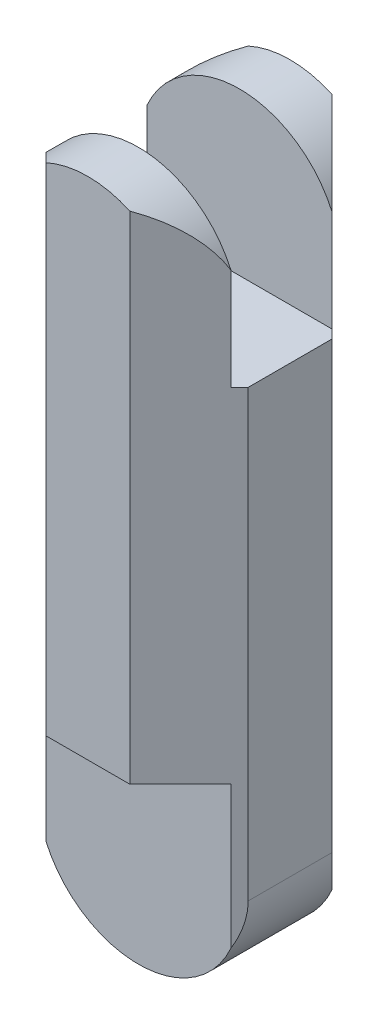
ISO-10303-21;
HEADER;
FILE_DESCRIPTION(('STEP AP214'),'2;1');
FILE_NAME('part.step','',(''),(''),'','','');
FILE_SCHEMA(('AUTOMOTIVE_DESIGN { 1 0 10303 214 1 1 1 1 }'));
ENDSEC;
DATA;
#1=APPLICATION_CONTEXT('core data for automotive mechanical design processes');
#2=APPLICATION_PROTOCOL_DEFINITION('international standard','automotive_design',2000,#1);
#3=PRODUCT_CONTEXT('',#1,'mechanical');
#4=PRODUCT('Part','Part','',(#3));
#5=PRODUCT_RELATED_PRODUCT_CATEGORY('part','',(#4));
#6=PRODUCT_DEFINITION_FORMATION('','',#4);
#7=PRODUCT_DEFINITION_CONTEXT('part definition',#1,'design');
#8=PRODUCT_DEFINITION('design','',#6,#7);
#9=PRODUCT_DEFINITION_SHAPE('','',#8);
#10=(LENGTH_UNIT() NAMED_UNIT(*) SI_UNIT(.MILLI.,.METRE.));
#11=(NAMED_UNIT(*) PLANE_ANGLE_UNIT() SI_UNIT($,.RADIAN.));
#12=(NAMED_UNIT(*) SI_UNIT($,.STERADIAN.) SOLID_ANGLE_UNIT());
#13=UNCERTAINTY_MEASURE_WITH_UNIT(LENGTH_MEASURE(1.E-05),#10,'distance_accuracy_value','');
#14=(GEOMETRIC_REPRESENTATION_CONTEXT(3) GLOBAL_UNCERTAINTY_ASSIGNED_CONTEXT((#13)) GLOBAL_UNIT_ASSIGNED_CONTEXT((#10,
#11,#12)) REPRESENTATION_CONTEXT('',''));
#15=CARTESIAN_POINT('',(0.,0.,0.));
#16=DIRECTION('',(0.,0.,1.));
#17=DIRECTION('',(1.,0.,0.));
#18=AXIS2_PLACEMENT_3D('',#15,#16,#17);
#19=CARTESIAN_POINT('',(4.14213562373094,74.,-10.));
#20=DIRECTION('',(0.,0.,1.));
#21=DIRECTION('',(1.,0.,0.));
#22=AXIS2_PLACEMENT_3D('',#19,#20,#21);
#23=PLANE('',#22);
#24=DIRECTION('',(0.,-1.,0.));
#25=VECTOR('',#24,1.);
#26=CARTESIAN_POINT('',(-4.14213562373096,74.,-10.));
#27=LINE('',#26,#25);
#28=CARTESIAN_POINT('',(-4.14213562373096,69.1017972112445,-10.));
#29=VERTEX_POINT('',#28);
#30=CARTESIAN_POINT('',(-4.14213562373096,20.,-10.));
#31=VERTEX_POINT('',#30);
#32=EDGE_CURVE('E174',#29,#31,#27,.T.);
#33=ORIENTED_EDGE('',*,*,#32,.F.);
#34=CARTESIAN_POINT('',(0.,60.,-10.));
#35=DIRECTION('',(0.,0.,1.));
#36=DIRECTION('',(1.,0.,0.));
#37=AXIS2_PLACEMENT_3D('',#34,#35,#36);
#38=CIRCLE('',#37,10.);
#39=CARTESIAN_POINT('',(4.14213562373094,69.1017972112445,-10.));
#40=VERTEX_POINT('',#39);
#41=EDGE_CURVE('E297',#29,#40,#38,.F.);
#42=ORIENTED_EDGE('',*,*,#41,.T.);
#43=DIRECTION('',(0.,-1.,0.));
#44=VECTOR('',#43,1.);
#45=CARTESIAN_POINT('',(4.14213562373094,74.,-10.));
#46=LINE('',#45,#44);
#47=CARTESIAN_POINT('',(4.14213562373094,20.,-10.));
#48=VERTEX_POINT('',#47);
#49=EDGE_CURVE('E176',#40,#48,#46,.T.);
#50=ORIENTED_EDGE('',*,*,#49,.T.);
#51=DIRECTION('',(1.,0.,0.));
#52=VECTOR('',#51,1.);
#53=CARTESIAN_POINT('',(10.,20.,-10.));
#54=LINE('',#53,#52);
#55=EDGE_CURVE('E232',#31,#48,#54,.T.);
#56=ORIENTED_EDGE('',*,*,#55,.F.);
#57=EDGE_LOOP('',(#33,#42,#50,#56));
#58=FACE_BOUND('',#57,.T.);
#59=ADVANCED_FACE('F34',(#58),#23,.F.);
#60=CARTESIAN_POINT('',(-4.14213562373096,74.,10.));
#61=DIRECTION('',(0.,0.,-1.));
#62=DIRECTION('',(-1.,0.,0.));
#63=AXIS2_PLACEMENT_3D('',#60,#61,#62);
#64=PLANE('',#63);
#65=DIRECTION('',(0.,-1.,0.));
#66=VECTOR('',#65,1.);
#67=CARTESIAN_POINT('',(4.14213562373096,74.,10.));
#68=LINE('',#67,#66);
#69=CARTESIAN_POINT('',(4.14213562373096,69.1017972112445,10.));
#70=VERTEX_POINT('',#69);
#71=CARTESIAN_POINT('',(4.14213562373096,20.,10.));
#72=VERTEX_POINT('',#71);
#73=EDGE_CURVE('E159',#70,#72,#68,.T.);
#74=ORIENTED_EDGE('',*,*,#73,.F.);
#75=CARTESIAN_POINT('',(0.,60.,10.));
#76=DIRECTION('',(0.,0.,-1.));
#77=DIRECTION('',(1.,0.,0.));
#78=AXIS2_PLACEMENT_3D('',#75,#76,#77);
#79=CIRCLE('',#78,10.);
#80=CARTESIAN_POINT('',(-4.14213562373096,69.1017972112445,10.));
#81=VERTEX_POINT('',#80);
#82=EDGE_CURVE('E147',#81,#70,#79,.T.);
#83=ORIENTED_EDGE('',*,*,#82,.F.);
#84=DIRECTION('',(0.,-1.,0.));
#85=VECTOR('',#84,1.);
#86=CARTESIAN_POINT('',(-4.14213562373096,74.,10.));
#87=LINE('',#86,#85);
#88=CARTESIAN_POINT('',(-4.14213562373096,20.,10.));
#89=VERTEX_POINT('',#88);
#90=EDGE_CURVE('E157',#81,#89,#87,.T.);
#91=ORIENTED_EDGE('',*,*,#90,.T.);
#92=DIRECTION('',(-1.,0.,0.));
#93=VECTOR('',#92,1.);
#94=CARTESIAN_POINT('',(-10.,20.,10.));
#95=LINE('',#94,#93);
#96=EDGE_CURVE('E245',#72,#89,#95,.T.);
#97=ORIENTED_EDGE('',*,*,#96,.F.);
#98=EDGE_LOOP('',(#74,#83,#91,#97));
#99=FACE_BOUND('',#98,.T.);
#100=ADVANCED_FACE('F155',(#99),#64,.F.);
#101=CARTESIAN_POINT('',(10.,74.,-4.14213562373095));
#102=DIRECTION('',(-0.707106781186547,0.,0.707106781186548));
#103=DIRECTION('',(0.707106781186548,0.,0.707106781186547));
#104=AXIS2_PLACEMENT_3D('',#101,#102,#103);
#105=PLANE('',#104);
#106=ORIENTED_EDGE('',*,*,#49,.F.);
#107=CARTESIAN_POINT('',(0.,60.,-14.1421356237309));
#108=DIRECTION('',(-0.707106781186547,0.,0.707106781186548));
#109=DIRECTION('',(0.707106781186548,0.,0.707106781186547));
#110=AXIS2_PLACEMENT_3D('',#107,#108,#109);
#111=ELLIPSE('',#110,14.1421356237309,10.);
#112=CARTESIAN_POINT('',(9.14213562373095,64.0523272618718,-5.));
#113=VERTEX_POINT('',#112);
#114=EDGE_CURVE('E300',#40,#113,#111,.F.);
#115=ORIENTED_EDGE('',*,*,#114,.T.);
#116=DIRECTION('',(0.,1.,0.));
#117=VECTOR('',#116,1.);
#118=CARTESIAN_POINT('',(9.14213562373095,74.,-5.));
#119=LINE('',#118,#117);
#120=CARTESIAN_POINT('',(9.14213562373095,54.,-5.));
#121=VERTEX_POINT('',#120);
#122=EDGE_CURVE('E221',#121,#113,#119,.T.);
#123=ORIENTED_EDGE('',*,*,#122,.F.);
#124=DIRECTION('',(0.707106781186548,0.,0.707106781186547));
#125=VECTOR('',#124,1.);
#126=CARTESIAN_POINT('',(10.,54.,-4.14213562373095));
#127=LINE('',#126,#125);
#128=CARTESIAN_POINT('',(10.,54.,-4.14213562373095));
#129=VERTEX_POINT('',#128);
#130=EDGE_CURVE('E230',#121,#129,#127,.T.);
#131=ORIENTED_EDGE('',*,*,#130,.T.);
#132=DIRECTION('',(0.,-1.,0.));
#133=VECTOR('',#132,1.);
#134=CARTESIAN_POINT('',(10.,74.,-4.14213562373095));
#135=LINE('',#134,#133);
#136=CARTESIAN_POINT('',(10.,10.,-4.14213562373095));
#137=VERTEX_POINT('',#136);
#138=EDGE_CURVE('E178',#129,#137,#135,.T.);
#139=ORIENTED_EDGE('',*,*,#138,.T.);
#140=CARTESIAN_POINT('',(0.,10.,-14.1421356237309));
#141=DIRECTION('',(-0.707106781186547,0.,0.707106781186548));
#142=DIRECTION('',(0.707106781186548,0.,0.707106781186547));
#143=AXIS2_PLACEMENT_3D('',#140,#141,#142);
#144=ELLIPSE('',#143,14.1421356237309,10.);
#145=CARTESIAN_POINT('',(9.14213562373095,5.94767273812816,-5.00000000000001));
#146=VERTEX_POINT('',#145);
#147=EDGE_CURVE('E269',#137,#146,#144,.F.);
#148=ORIENTED_EDGE('',*,*,#147,.T.);
#149=DIRECTION('',(0.,-1.,0.));
#150=VECTOR('',#149,1.);
#151=CARTESIAN_POINT('',(9.14213562373095,74.,-5.00000000000001));
#152=LINE('',#151,#150);
#153=CARTESIAN_POINT('',(9.14213562373095,20.,-5.00000000000001));
#154=VERTEX_POINT('',#153);
#155=EDGE_CURVE('E238',#154,#146,#152,.T.);
#156=ORIENTED_EDGE('',*,*,#155,.F.);
#157=DIRECTION('',(-0.707106781186548,0.,-0.707106781186547));
#158=VECTOR('',#157,1.);
#159=CARTESIAN_POINT('',(10.,20.,-4.14213562373095));
#160=LINE('',#159,#158);
#161=EDGE_CURVE('E242',#154,#48,#160,.T.);
#162=ORIENTED_EDGE('',*,*,#161,.T.);
#163=EDGE_LOOP('',(#106,#115,#123,#131,#139,#148,#156,#162));
#164=FACE_BOUND('',#163,.T.);
#165=ADVANCED_FACE('F275',(#164),#105,.F.);
#166=CARTESIAN_POINT('',(-4.14213562373096,74.,-10.));
#167=DIRECTION('',(0.707106781186548,0.,0.707106781186547));
#168=DIRECTION('',(0.707106781186547,0.,-0.707106781186548));
#169=AXIS2_PLACEMENT_3D('',#166,#167,#168);
#170=PLANE('',#169);
#171=DIRECTION('',(0.,-1.,0.));
#172=VECTOR('',#171,1.);
#173=CARTESIAN_POINT('',(-9.14213562373095,74.,-5.));
#174=LINE('',#173,#172);
#175=CARTESIAN_POINT('',(-9.14213562373095,64.0523272618718,-5.));
#176=VERTEX_POINT('',#175);
#177=CARTESIAN_POINT('',(-9.14213562373095,54.,-5.));
#178=VERTEX_POINT('',#177);
#179=EDGE_CURVE('E219',#176,#178,#174,.T.);
#180=ORIENTED_EDGE('',*,*,#179,.F.);
#181=CARTESIAN_POINT('',(0.,60.,-14.142135623731));
#182=DIRECTION('',(0.707106781186548,0.,0.707106781186547));
#183=DIRECTION('',(-0.707106781186547,0.,0.707106781186548));
#184=AXIS2_PLACEMENT_3D('',#181,#182,#183);
#185=ELLIPSE('',#184,14.142135623731,10.);
#186=EDGE_CURVE('E49',#176,#29,#185,.F.);
#187=ORIENTED_EDGE('',*,*,#186,.T.);
#188=ORIENTED_EDGE('',*,*,#32,.T.);
#189=DIRECTION('',(-0.707106781186547,0.,0.707106781186548));
#190=VECTOR('',#189,1.);
#191=CARTESIAN_POINT('',(-4.14213562373096,20.,-10.));
#192=LINE('',#191,#190);
#193=CARTESIAN_POINT('',(-9.14213562373096,20.,-5.));
#194=VERTEX_POINT('',#193);
#195=EDGE_CURVE('E187',#31,#194,#192,.T.);
#196=ORIENTED_EDGE('',*,*,#195,.T.);
#197=DIRECTION('',(0.,1.,0.));
#198=VECTOR('',#197,1.);
#199=CARTESIAN_POINT('',(-9.14213562373095,74.,-5.));
#200=LINE('',#199,#198);
#201=CARTESIAN_POINT('',(-9.14213562373095,5.94767273812823,-5.));
#202=VERTEX_POINT('',#201);
#203=EDGE_CURVE('E185',#202,#194,#200,.T.);
#204=ORIENTED_EDGE('',*,*,#203,.F.);
#205=CARTESIAN_POINT('',(0.,10.,-14.142135623731));
#206=DIRECTION('',(0.707106781186548,0.,0.707106781186547));
#207=DIRECTION('',(-0.707106781186547,0.,0.707106781186548));
#208=AXIS2_PLACEMENT_3D('',#205,#206,#207);
#209=ELLIPSE('',#208,14.142135623731,10.);
#210=CARTESIAN_POINT('',(-10.,10.,-4.14213562373095));
#211=VERTEX_POINT('',#210);
#212=EDGE_CURVE('E259',#202,#211,#209,.F.);
#213=ORIENTED_EDGE('',*,*,#212,.T.);
#214=DIRECTION('',(0.,-1.,0.));
#215=VECTOR('',#214,1.);
#216=CARTESIAN_POINT('',(-10.,74.,-4.14213562373095));
#217=LINE('',#216,#215);
#218=CARTESIAN_POINT('',(-10.,54.,-4.14213562373095));
#219=VERTEX_POINT('',#218);
#220=EDGE_CURVE('E167',#219,#211,#217,.T.);
#221=ORIENTED_EDGE('',*,*,#220,.F.);
#222=DIRECTION('',(0.707106781186547,0.,-0.707106781186548));
#223=VECTOR('',#222,1.);
#224=CARTESIAN_POINT('',(-4.14213562373096,54.,-10.));
#225=LINE('',#224,#223);
#226=EDGE_CURVE('E227',#219,#178,#225,.T.);
#227=ORIENTED_EDGE('',*,*,#226,.T.);
#228=EDGE_LOOP('',(#180,#187,#188,#196,#204,#213,#221,#227));
#229=FACE_BOUND('',#228,.T.);
#230=ADVANCED_FACE('F288',(#229),#170,.F.);
#231=CARTESIAN_POINT('',(0.,0.,-5.));
#232=DIRECTION('',(0.,0.,1.));
#233=DIRECTION('',(1.,0.,0.));
#234=AXIS2_PLACEMENT_3D('',#231,#232,#233);
#235=PLANE('',#234);
#236=CARTESIAN_POINT('',(0.,60.,-5.));
#237=DIRECTION('',(0.,0.,1.));
#238=DIRECTION('',(1.,0.,0.));
#239=AXIS2_PLACEMENT_3D('',#236,#237,#238);
#240=CIRCLE('',#239,10.);
#241=EDGE_CURVE('E151',#176,#113,#240,.F.);
#242=ORIENTED_EDGE('',*,*,#241,.F.);
#243=ORIENTED_EDGE('',*,*,#179,.T.);
#244=DIRECTION('',(1.,0.,0.));
#245=VECTOR('',#244,1.);
#246=CARTESIAN_POINT('',(-10.,54.,-5.));
#247=LINE('',#246,#245);
#248=EDGE_CURVE('E213',#178,#121,#247,.T.);
#249=ORIENTED_EDGE('',*,*,#248,.T.);
#250=ORIENTED_EDGE('',*,*,#122,.T.);
#251=EDGE_LOOP('',(#242,#243,#249,#250));
#252=FACE_BOUND('',#251,.T.);
#253=ADVANCED_FACE('F304',(#252),#235,.T.);
#254=CARTESIAN_POINT('',(0.,0.,5.));
#255=DIRECTION('',(0.,0.,1.));
#256=DIRECTION('',(1.,0.,0.));
#257=AXIS2_PLACEMENT_3D('',#254,#255,#256);
#258=PLANE('',#257);
#259=DIRECTION('',(0.,-1.,0.));
#260=VECTOR('',#259,1.);
#261=CARTESIAN_POINT('',(-9.14213562373096,74.,5.));
#262=LINE('',#261,#260);
#263=CARTESIAN_POINT('',(-9.14213562373096,64.0523272618718,5.));
#264=VERTEX_POINT('',#263);
#265=CARTESIAN_POINT('',(-9.14213562373096,54.,5.));
#266=VERTEX_POINT('',#265);
#267=EDGE_CURVE('E211',#264,#266,#262,.T.);
#268=ORIENTED_EDGE('',*,*,#267,.F.);
#269=CARTESIAN_POINT('',(0.,60.,5.));
#270=DIRECTION('',(0.,0.,1.));
#271=DIRECTION('',(1.,0.,0.));
#272=AXIS2_PLACEMENT_3D('',#269,#270,#271);
#273=CIRCLE('',#272,10.);
#274=CARTESIAN_POINT('',(9.14213562373096,64.0523272618718,5.));
#275=VERTEX_POINT('',#274);
#276=EDGE_CURVE('E11',#264,#275,#273,.F.);
#277=ORIENTED_EDGE('',*,*,#276,.T.);
#278=DIRECTION('',(0.,1.,0.));
#279=VECTOR('',#278,1.);
#280=CARTESIAN_POINT('',(9.14213562373096,74.,5.));
#281=LINE('',#280,#279);
#282=CARTESIAN_POINT('',(9.14213562373096,54.,5.));
#283=VERTEX_POINT('',#282);
#284=EDGE_CURVE('E194',#283,#275,#281,.T.);
#285=ORIENTED_EDGE('',*,*,#284,.F.);
#286=DIRECTION('',(1.,0.,0.));
#287=VECTOR('',#286,1.);
#288=CARTESIAN_POINT('',(-10.,54.,5.));
#289=LINE('',#288,#287);
#290=EDGE_CURVE('E205',#266,#283,#289,.T.);
#291=ORIENTED_EDGE('',*,*,#290,.F.);
#292=EDGE_LOOP('',(#268,#277,#285,#291));
#293=FACE_BOUND('',#292,.T.);
#294=ADVANCED_FACE('F323',(#293),#258,.F.);
#295=CARTESIAN_POINT('',(0.,10.,-56.));
#296=DIRECTION('',(0.,0.,1.));
#297=DIRECTION('',(1.,0.,0.));
#298=AXIS2_PLACEMENT_3D('',#295,#296,#297);
#299=CYLINDRICAL_SURFACE('',#298,10.);
#300=CARTESIAN_POINT('',(0.,10.,-5.));
#301=DIRECTION('',(0.,0.,-1.));
#302=DIRECTION('',(-1.,0.,0.));
#303=AXIS2_PLACEMENT_3D('',#300,#301,#302);
#304=CIRCLE('',#303,10.);
#305=EDGE_CURVE('E233',#146,#202,#304,.T.);
#306=ORIENTED_EDGE('',*,*,#305,.F.);
#307=ORIENTED_EDGE('',*,*,#147,.F.);
#308=DIRECTION('',(0.,0.,1.));
#309=VECTOR('',#308,1.);
#310=CARTESIAN_POINT('',(10.,10.,-56.));
#311=LINE('',#310,#309);
#312=CARTESIAN_POINT('',(10.,9.99999999999999,4.14213562373095));
#313=VERTEX_POINT('',#312);
#314=EDGE_CURVE('E256',#137,#313,#311,.T.);
#315=ORIENTED_EDGE('',*,*,#314,.T.);
#316=CARTESIAN_POINT('',(0.,10.,14.1421356237309));
#317=DIRECTION('',(-0.707106781186547,0.,-0.707106781186548));
#318=DIRECTION('',(-0.707106781186548,0.,0.707106781186547));
#319=AXIS2_PLACEMENT_3D('',#316,#317,#318);
#320=ELLIPSE('',#319,14.1421356237309,10.);
#321=CARTESIAN_POINT('',(9.14213562373095,5.94767273812818,5.));
#322=VERTEX_POINT('',#321);
#323=EDGE_CURVE('E264',#322,#313,#320,.F.);
#324=ORIENTED_EDGE('',*,*,#323,.F.);
#325=CARTESIAN_POINT('',(0.,10.,5.));
#326=DIRECTION('',(0.,0.,1.));
#327=DIRECTION('',(1.,0.,0.));
#328=AXIS2_PLACEMENT_3D('',#325,#326,#327);
#329=CIRCLE('',#328,10.);
#330=CARTESIAN_POINT('',(-9.14213562373095,5.94767273812819,5.00000000000001));
#331=VERTEX_POINT('',#330);
#332=EDGE_CURVE('E180',#331,#322,#329,.T.);
#333=ORIENTED_EDGE('',*,*,#332,.F.);
#334=CARTESIAN_POINT('',(0.,10.,14.142135623731));
#335=DIRECTION('',(0.707106781186548,0.,-0.707106781186547));
#336=DIRECTION('',(0.707106781186547,0.,0.707106781186548));
#337=AXIS2_PLACEMENT_3D('',#334,#335,#336);
#338=ELLIPSE('',#337,14.142135623731,10.);
#339=CARTESIAN_POINT('',(-10.,10.,4.14213562373096));
#340=VERTEX_POINT('',#339);
#341=EDGE_CURVE('E266',#340,#331,#338,.F.);
#342=ORIENTED_EDGE('',*,*,#341,.F.);
#343=DIRECTION('',(0.,0.,1.));
#344=VECTOR('',#343,1.);
#345=CARTESIAN_POINT('',(-10.,10.,-56.));
#346=LINE('',#345,#344);
#347=EDGE_CURVE('E255',#211,#340,#346,.T.);
#348=ORIENTED_EDGE('',*,*,#347,.F.);
#349=ORIENTED_EDGE('',*,*,#212,.F.);
#350=EDGE_LOOP('',(#306,#307,#315,#324,#333,#342,#348,#349));
#351=FACE_BOUND('',#350,.T.);
#352=ADVANCED_FACE('F278',(#351),#299,.T.);
#353=CARTESIAN_POINT('',(-10.,74.,-4.14213562373095));
#354=DIRECTION('',(1.,0.,0.));
#355=DIRECTION('',(0.,0.,-1.));
#356=AXIS2_PLACEMENT_3D('',#353,#354,#355);
#357=PLANE('',#356);
#358=DIRECTION('',(0.,-1.,0.));
#359=VECTOR('',#358,1.);
#360=CARTESIAN_POINT('',(-10.,74.,4.14213562373096));
#361=LINE('',#360,#359);
#362=CARTESIAN_POINT('',(-10.,54.,4.14213562373096));
#363=VERTEX_POINT('',#362);
#364=EDGE_CURVE('E165',#363,#340,#361,.T.);
#365=ORIENTED_EDGE('',*,*,#364,.F.);
#366=DIRECTION('',(0.,0.,1.));
#367=VECTOR('',#366,1.);
#368=CARTESIAN_POINT('',(-10.,54.,-5.));
#369=LINE('',#368,#367);
#370=EDGE_CURVE('E209',#219,#363,#369,.T.);
#371=ORIENTED_EDGE('',*,*,#370,.F.);
#372=ORIENTED_EDGE('',*,*,#220,.T.);
#373=ORIENTED_EDGE('',*,*,#347,.T.);
#374=EDGE_LOOP('',(#365,#371,#372,#373));
#375=FACE_BOUND('',#374,.T.);
#376=ADVANCED_FACE('F320',(#375),#357,.F.);
#377=CARTESIAN_POINT('',(10.,74.,4.14213562373095));
#378=DIRECTION('',(-1.,0.,0.));
#379=DIRECTION('',(0.,0.,1.));
#380=AXIS2_PLACEMENT_3D('',#377,#378,#379);
#381=PLANE('',#380);
#382=ORIENTED_EDGE('',*,*,#138,.F.);
#383=DIRECTION('',(0.,0.,1.));
#384=VECTOR('',#383,1.);
#385=CARTESIAN_POINT('',(10.,54.,-5.));
#386=LINE('',#385,#384);
#387=CARTESIAN_POINT('',(10.,54.,4.14213562373096));
#388=VERTEX_POINT('',#387);
#389=EDGE_CURVE('E201',#129,#388,#386,.T.);
#390=ORIENTED_EDGE('',*,*,#389,.T.);
#391=DIRECTION('',(0.,-1.,0.));
#392=VECTOR('',#391,1.);
#393=CARTESIAN_POINT('',(10.,74.,4.14213562373095));
#394=LINE('',#393,#392);
#395=EDGE_CURVE('E169',#388,#313,#394,.T.);
#396=ORIENTED_EDGE('',*,*,#395,.T.);
#397=ORIENTED_EDGE('',*,*,#314,.F.);
#398=EDGE_LOOP('',(#382,#390,#396,#397));
#399=FACE_BOUND('',#398,.T.);
#400=ADVANCED_FACE('F36',(#399),#381,.F.);
#401=CARTESIAN_POINT('',(-10.,74.,4.14213562373096));
#402=DIRECTION('',(0.707106781186548,0.,-0.707106781186547));
#403=DIRECTION('',(-0.707106781186547,0.,-0.707106781186548));
#404=AXIS2_PLACEMENT_3D('',#401,#402,#403);
#405=PLANE('',#404);
#406=ORIENTED_EDGE('',*,*,#90,.F.);
#407=CARTESIAN_POINT('',(0.,60.,14.142135623731));
#408=DIRECTION('',(0.707106781186548,0.,-0.707106781186547));
#409=DIRECTION('',(0.707106781186547,0.,0.707106781186548));
#410=AXIS2_PLACEMENT_3D('',#407,#408,#409);
#411=ELLIPSE('',#410,14.142135623731,10.);
#412=EDGE_CURVE('E144',#81,#264,#411,.F.);
#413=ORIENTED_EDGE('',*,*,#412,.T.);
#414=ORIENTED_EDGE('',*,*,#267,.T.);
#415=DIRECTION('',(-0.707106781186547,0.,-0.707106781186548));
#416=VECTOR('',#415,1.);
#417=CARTESIAN_POINT('',(-10.,54.,4.14213562373096));
#418=LINE('',#417,#416);
#419=EDGE_CURVE('E224',#266,#363,#418,.T.);
#420=ORIENTED_EDGE('',*,*,#419,.T.);
#421=ORIENTED_EDGE('',*,*,#364,.T.);
#422=ORIENTED_EDGE('',*,*,#341,.T.);
#423=DIRECTION('',(0.,-1.,0.));
#424=VECTOR('',#423,1.);
#425=CARTESIAN_POINT('',(-9.14213562373095,74.,5.));
#426=LINE('',#425,#424);
#427=CARTESIAN_POINT('',(-9.14213562373095,20.,5.));
#428=VERTEX_POINT('',#427);
#429=EDGE_CURVE('E252',#428,#331,#426,.T.);
#430=ORIENTED_EDGE('',*,*,#429,.F.);
#431=DIRECTION('',(0.707106781186547,0.,0.707106781186548));
#432=VECTOR('',#431,1.);
#433=CARTESIAN_POINT('',(-10.,20.,4.14213562373096));
#434=LINE('',#433,#432);
#435=EDGE_CURVE('E164',#428,#89,#434,.T.);
#436=ORIENTED_EDGE('',*,*,#435,.T.);
#437=EDGE_LOOP('',(#406,#413,#414,#420,#421,#422,#430,#436));
#438=FACE_BOUND('',#437,.T.);
#439=ADVANCED_FACE('F162',(#438),#405,.F.);
#440=CARTESIAN_POINT('',(4.14213562373096,74.,10.));
#441=DIRECTION('',(-0.707106781186547,0.,-0.707106781186548));
#442=DIRECTION('',(-0.707106781186548,0.,0.707106781186547));
#443=AXIS2_PLACEMENT_3D('',#440,#441,#442);
#444=PLANE('',#443);
#445=ORIENTED_EDGE('',*,*,#284,.T.);
#446=CARTESIAN_POINT('',(0.,60.,14.142135623731));
#447=DIRECTION('',(-0.707106781186547,0.,-0.707106781186548));
#448=DIRECTION('',(-0.707106781186548,0.,0.707106781186547));
#449=AXIS2_PLACEMENT_3D('',#446,#447,#448);
#450=ELLIPSE('',#449,14.1421356237309,10.);
#451=EDGE_CURVE('E57',#275,#70,#450,.F.);
#452=ORIENTED_EDGE('',*,*,#451,.T.);
#453=ORIENTED_EDGE('',*,*,#73,.T.);
#454=DIRECTION('',(0.707106781186548,0.,-0.707106781186547));
#455=VECTOR('',#454,1.);
#456=CARTESIAN_POINT('',(4.14213562373096,20.,10.));
#457=LINE('',#456,#455);
#458=CARTESIAN_POINT('',(9.14213562373096,20.,5.));
#459=VERTEX_POINT('',#458);
#460=EDGE_CURVE('E182',#72,#459,#457,.T.);
#461=ORIENTED_EDGE('',*,*,#460,.T.);
#462=DIRECTION('',(0.,1.,0.));
#463=VECTOR('',#462,1.);
#464=CARTESIAN_POINT('',(9.14213562373095,74.,5.));
#465=LINE('',#464,#463);
#466=EDGE_CURVE('E249',#322,#459,#465,.T.);
#467=ORIENTED_EDGE('',*,*,#466,.F.);
#468=ORIENTED_EDGE('',*,*,#323,.T.);
#469=ORIENTED_EDGE('',*,*,#395,.F.);
#470=DIRECTION('',(-0.707106781186548,0.,0.707106781186547));
#471=VECTOR('',#470,1.);
#472=CARTESIAN_POINT('',(4.14213562373096,54.,10.));
#473=LINE('',#472,#471);
#474=EDGE_CURVE('E42',#388,#283,#473,.T.);
#475=ORIENTED_EDGE('',*,*,#474,.T.);
#476=EDGE_LOOP('',(#445,#452,#453,#461,#467,#468,#469,#475));
#477=FACE_BOUND('',#476,.T.);
#478=ADVANCED_FACE('F193',(#477),#444,.F.);
#479=CARTESIAN_POINT('',(-10.,20.,5.));
#480=DIRECTION('',(0.,1.,0.));
#481=DIRECTION('',(0.,0.,1.));
#482=AXIS2_PLACEMENT_3D('',#479,#480,#481);
#483=PLANE('',#482);
#484=DIRECTION('',(-1.,0.,0.));
#485=VECTOR('',#484,1.);
#486=CARTESIAN_POINT('',(-10.,20.,5.));
#487=LINE('',#486,#485);
#488=EDGE_CURVE('E246',#459,#428,#487,.T.);
#489=ORIENTED_EDGE('',*,*,#488,.F.);
#490=ORIENTED_EDGE('',*,*,#460,.F.);
#491=ORIENTED_EDGE('',*,*,#96,.T.);
#492=ORIENTED_EDGE('',*,*,#435,.F.);
#493=EDGE_LOOP('',(#489,#490,#491,#492));
#494=FACE_BOUND('',#493,.T.);
#495=ADVANCED_FACE('F313',(#494),#483,.F.);
#496=CARTESIAN_POINT('',(0.,10.,5.));
#497=DIRECTION('',(0.,0.,1.));
#498=DIRECTION('',(1.,0.,0.));
#499=AXIS2_PLACEMENT_3D('',#496,#497,#498);
#500=PLANE('',#499);
#501=ORIENTED_EDGE('',*,*,#429,.T.);
#502=ORIENTED_EDGE('',*,*,#332,.T.);
#503=ORIENTED_EDGE('',*,*,#466,.T.);
#504=ORIENTED_EDGE('',*,*,#488,.T.);
#505=EDGE_LOOP('',(#501,#502,#503,#504));
#506=FACE_BOUND('',#505,.T.);
#507=ADVANCED_FACE('F315',(#506),#500,.T.);
#508=CARTESIAN_POINT('',(10.,20.,-5.00000000000001));
#509=DIRECTION('',(0.,1.,0.));
#510=DIRECTION('',(0.,0.,1.));
#511=AXIS2_PLACEMENT_3D('',#508,#509,#510);
#512=PLANE('',#511);
#513=DIRECTION('',(1.,0.,0.));
#514=VECTOR('',#513,1.);
#515=CARTESIAN_POINT('',(10.,20.,-5.00000000000001));
#516=LINE('',#515,#514);
#517=EDGE_CURVE('E235',#194,#154,#516,.T.);
#518=ORIENTED_EDGE('',*,*,#517,.F.);
#519=ORIENTED_EDGE('',*,*,#195,.F.);
#520=ORIENTED_EDGE('',*,*,#55,.T.);
#521=ORIENTED_EDGE('',*,*,#161,.F.);
#522=EDGE_LOOP('',(#518,#519,#520,#521));
#523=FACE_BOUND('',#522,.T.);
#524=ADVANCED_FACE('F294',(#523),#512,.F.);
#525=CARTESIAN_POINT('',(0.,10.,-5.));
#526=DIRECTION('',(0.,0.,-1.));
#527=DIRECTION('',(-1.,0.,0.));
#528=AXIS2_PLACEMENT_3D('',#525,#526,#527);
#529=PLANE('',#528);
#530=ORIENTED_EDGE('',*,*,#155,.T.);
#531=ORIENTED_EDGE('',*,*,#305,.T.);
#532=ORIENTED_EDGE('',*,*,#203,.T.);
#533=ORIENTED_EDGE('',*,*,#517,.T.);
#534=EDGE_LOOP('',(#530,#531,#532,#533));
#535=FACE_BOUND('',#534,.T.);
#536=ADVANCED_FACE('F284',(#535),#529,.T.);
#537=CARTESIAN_POINT('',(-10.,54.,-5.));
#538=DIRECTION('',(0.,-1.,0.));
#539=DIRECTION('',(0.,0.,-1.));
#540=AXIS2_PLACEMENT_3D('',#537,#538,#539);
#541=PLANE('',#540);
#542=ORIENTED_EDGE('',*,*,#248,.F.);
#543=ORIENTED_EDGE('',*,*,#226,.F.);
#544=ORIENTED_EDGE('',*,*,#370,.T.);
#545=ORIENTED_EDGE('',*,*,#419,.F.);
#546=ORIENTED_EDGE('',*,*,#290,.T.);
#547=ORIENTED_EDGE('',*,*,#474,.F.);
#548=ORIENTED_EDGE('',*,*,#389,.F.);
#549=ORIENTED_EDGE('',*,*,#130,.F.);
#550=EDGE_LOOP('',(#542,#543,#544,#545,#546,#547,#548,#549));
#551=FACE_BOUND('',#550,.T.);
#552=ADVANCED_FACE('F200',(#551),#541,.F.);
#553=CARTESIAN_POINT('',(0.,60.,-20.));
#554=DIRECTION('',(0.,0.,1.));
#555=DIRECTION('',(1.,0.,0.));
#556=AXIS2_PLACEMENT_3D('',#553,#554,#555);
#557=CYLINDRICAL_SURFACE('',#556,10.);
#558=ORIENTED_EDGE('',*,*,#82,.T.);
#559=ORIENTED_EDGE('',*,*,#451,.F.);
#560=ORIENTED_EDGE('',*,*,#276,.F.);
#561=ORIENTED_EDGE('',*,*,#412,.F.);
#562=EDGE_LOOP('',(#558,#559,#560,#561));
#563=FACE_BOUND('',#562,.T.);
#564=ADVANCED_FACE('F146',(#563),#557,.T.);
#565=ORIENTED_EDGE('',*,*,#186,.F.);
#566=ORIENTED_EDGE('',*,*,#241,.T.);
#567=ORIENTED_EDGE('',*,*,#114,.F.);
#568=ORIENTED_EDGE('',*,*,#41,.F.);
#569=EDGE_LOOP('',(#565,#566,#567,#568));
#570=FACE_BOUND('',#569,.T.);
#571=ADVANCED_FACE('F385',(#570),#557,.T.);
#572=CLOSED_SHELL('',(#59,#100,#165,#230,#253,#294,#352,#376,#400,#439,#478,#495,#507,#524,#536,
#552,#564,#571));
#573=MANIFOLD_SOLID_BREP('B2',#572);
#574=ADVANCED_BREP_SHAPE_REPRESENTATION('',(#18,#573),#14);
#575=SHAPE_DEFINITION_REPRESENTATION(#9,#574);
ENDSEC;
END-ISO-10303-21;
